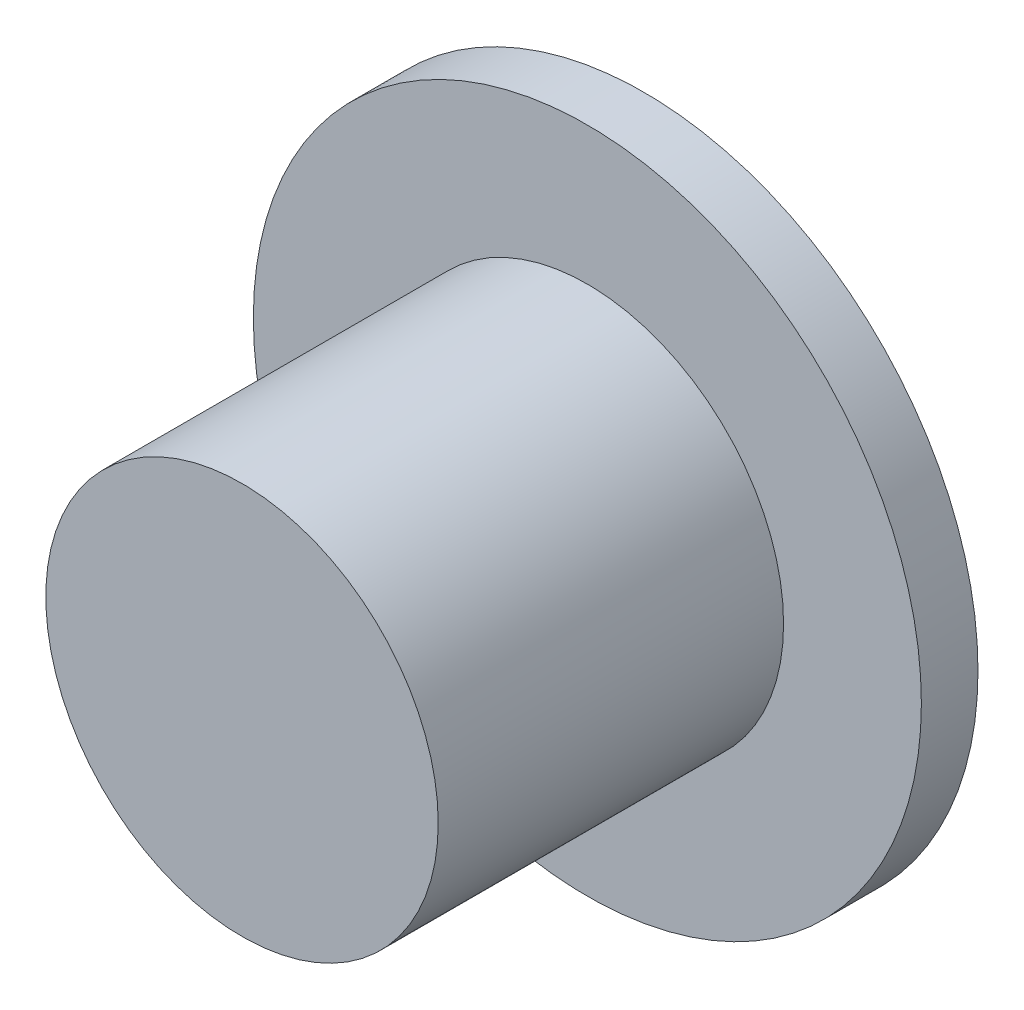
ISO-10303-21;
HEADER;
FILE_DESCRIPTION(('STEP AP214'),'2;1');
FILE_NAME('part.step','',(''),(''),'','','');
FILE_SCHEMA(('AUTOMOTIVE_DESIGN { 1 0 10303 214 1 1 1 1 }'));
ENDSEC;
DATA;
#1=APPLICATION_CONTEXT('core data for automotive mechanical design processes');
#2=APPLICATION_PROTOCOL_DEFINITION('international standard','automotive_design',2000,#1);
#3=PRODUCT_CONTEXT('',#1,'mechanical');
#4=PRODUCT('Part','Part','',(#3));
#5=PRODUCT_RELATED_PRODUCT_CATEGORY('part','',(#4));
#6=PRODUCT_DEFINITION_FORMATION('','',#4);
#7=PRODUCT_DEFINITION_CONTEXT('part definition',#1,'design');
#8=PRODUCT_DEFINITION('design','',#6,#7);
#9=PRODUCT_DEFINITION_SHAPE('','',#8);
#10=(LENGTH_UNIT() NAMED_UNIT(*) SI_UNIT(.MILLI.,.METRE.));
#11=(NAMED_UNIT(*) PLANE_ANGLE_UNIT() SI_UNIT($,.RADIAN.));
#12=(NAMED_UNIT(*) SI_UNIT($,.STERADIAN.) SOLID_ANGLE_UNIT());
#13=UNCERTAINTY_MEASURE_WITH_UNIT(LENGTH_MEASURE(1.E-05),#10,'distance_accuracy_value','');
#14=(GEOMETRIC_REPRESENTATION_CONTEXT(3) GLOBAL_UNCERTAINTY_ASSIGNED_CONTEXT((#13)) GLOBAL_UNIT_ASSIGNED_CONTEXT((#10,
#11,#12)) REPRESENTATION_CONTEXT('',''));
#15=CARTESIAN_POINT('',(0.,0.,0.));
#16=DIRECTION('',(0.,0.,1.));
#17=DIRECTION('',(1.,0.,0.));
#18=AXIS2_PLACEMENT_3D('',#15,#16,#17);
#19=CARTESIAN_POINT('',(0.,0.,10.));
#20=DIRECTION('',(0.,0.,-1.));
#21=DIRECTION('',(-1.,0.,0.));
#22=AXIS2_PLACEMENT_3D('',#19,#20,#21);
#23=CYLINDRICAL_SURFACE('',#22,58.9984483778357);
#24=CARTESIAN_POINT('',(0.,0.,10.));
#25=DIRECTION('',(0.,0.,1.));
#26=DIRECTION('',(1.,0.,0.));
#27=AXIS2_PLACEMENT_3D('',#24,#25,#26);
#28=CIRCLE('',#27,58.9984483778357);
#29=CARTESIAN_POINT('',(58.9984483778357,0.,10.));
#30=VERTEX_POINT('',#29);
#31=EDGE_CURVE('E45',#30,#30,#28,.T.);
#32=ORIENTED_EDGE('',*,*,#31,.F.);
#33=EDGE_LOOP('',(#32));
#34=FACE_BOUND('',#33,.T.);
#35=CARTESIAN_POINT('',(0.,0.,0.));
#36=DIRECTION('',(0.,0.,1.));
#37=DIRECTION('',(1.,0.,0.));
#38=AXIS2_PLACEMENT_3D('',#35,#36,#37);
#39=CIRCLE('',#38,58.9984483778357);
#40=CARTESIAN_POINT('',(58.9984483778357,0.,0.));
#41=VERTEX_POINT('',#40);
#42=EDGE_CURVE('E40',#41,#41,#39,.T.);
#43=ORIENTED_EDGE('',*,*,#42,.T.);
#44=EDGE_LOOP('',(#43));
#45=FACE_BOUND('',#44,.T.);
#46=ADVANCED_FACE('F37',(#34,#45),#23,.T.);
#47=CARTESIAN_POINT('',(0.,0.,10.));
#48=DIRECTION('',(0.,0.,1.));
#49=DIRECTION('',(1.,0.,0.));
#50=AXIS2_PLACEMENT_3D('',#47,#48,#49);
#51=PLANE('',#50);
#52=CARTESIAN_POINT('',(0.,0.,10.));
#53=DIRECTION('',(0.,0.,1.));
#54=DIRECTION('',(1.,0.,0.));
#55=AXIS2_PLACEMENT_3D('',#52,#53,#54);
#56=CIRCLE('',#55,34.6577901652959);
#57=CARTESIAN_POINT('',(34.6577901652959,0.,10.));
#58=VERTEX_POINT('',#57);
#59=EDGE_CURVE('E10',#58,#58,#56,.T.);
#60=ORIENTED_EDGE('',*,*,#59,.F.);
#61=EDGE_LOOP('',(#60));
#62=FACE_BOUND('',#61,.T.);
#63=ORIENTED_EDGE('',*,*,#31,.T.);
#64=EDGE_LOOP('',(#63));
#65=FACE_BOUND('',#64,.T.);
#66=ADVANCED_FACE('F65',(#62,#65),#51,.T.);
#67=CARTESIAN_POINT('',(0.,0.,0.));
#68=DIRECTION('',(0.,0.,1.));
#69=DIRECTION('',(1.,0.,0.));
#70=AXIS2_PLACEMENT_3D('',#67,#68,#69);
#71=PLANE('',#70);
#72=ORIENTED_EDGE('',*,*,#42,.F.);
#73=EDGE_LOOP('',(#72));
#74=FACE_BOUND('',#73,.T.);
#75=ADVANCED_FACE('F62',(#74),#71,.F.);
#76=CARTESIAN_POINT('',(0.,0.,71.));
#77=DIRECTION('',(0.,0.,-1.));
#78=DIRECTION('',(-1.,0.,0.));
#79=AXIS2_PLACEMENT_3D('',#76,#77,#78);
#80=CYLINDRICAL_SURFACE('',#79,34.6577901652959);
#81=CARTESIAN_POINT('',(0.,0.,71.));
#82=DIRECTION('',(0.,0.,1.));
#83=DIRECTION('',(1.,0.,0.));
#84=AXIS2_PLACEMENT_3D('',#81,#82,#83);
#85=CIRCLE('',#84,34.6577901652959);
#86=CARTESIAN_POINT('',(34.6577901652959,0.,71.));
#87=VERTEX_POINT('',#86);
#88=EDGE_CURVE('E52',#87,#87,#85,.T.);
#89=ORIENTED_EDGE('',*,*,#88,.F.);
#90=EDGE_LOOP('',(#89));
#91=FACE_BOUND('',#90,.T.);
#92=ORIENTED_EDGE('',*,*,#59,.T.);
#93=EDGE_LOOP('',(#92));
#94=FACE_BOUND('',#93,.T.);
#95=ADVANCED_FACE('F64',(#91,#94),#80,.T.);
#96=CARTESIAN_POINT('',(0.,0.,71.));
#97=DIRECTION('',(0.,0.,1.));
#98=DIRECTION('',(1.,0.,0.));
#99=AXIS2_PLACEMENT_3D('',#96,#97,#98);
#100=PLANE('',#99);
#101=ORIENTED_EDGE('',*,*,#88,.T.);
#102=EDGE_LOOP('',(#101));
#103=FACE_BOUND('',#102,.T.);
#104=ADVANCED_FACE('F70',(#103),#100,.T.);
#105=CLOSED_SHELL('',(#46,#66,#75,#95,#104));
#106=MANIFOLD_SOLID_BREP('B2',#105);
#107=ADVANCED_BREP_SHAPE_REPRESENTATION('',(#18,#106),#14);
#108=SHAPE_DEFINITION_REPRESENTATION(#9,#107);
ENDSEC;
END-ISO-10303-21;
